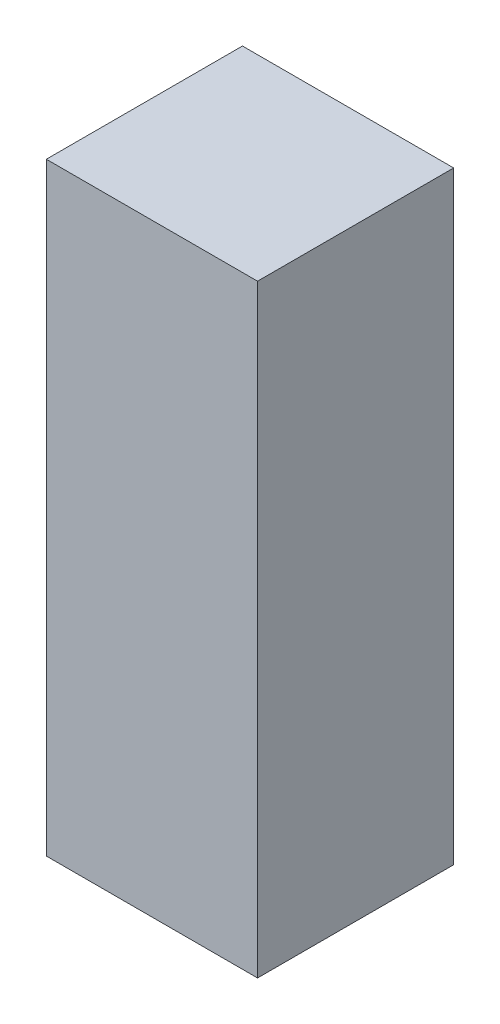
ISO-10303-21;
HEADER;
FILE_DESCRIPTION(('STEP AP214'),'2;1');
FILE_NAME('part.step','',(''),(''),'','','');
FILE_SCHEMA(('AUTOMOTIVE_DESIGN { 1 0 10303 214 1 1 1 1 }'));
ENDSEC;
DATA;
#1=APPLICATION_CONTEXT('core data for automotive mechanical design processes');
#2=APPLICATION_PROTOCOL_DEFINITION('international standard','automotive_design',2000,#1);
#3=PRODUCT_CONTEXT('',#1,'mechanical');
#4=PRODUCT('Part','Part','',(#3));
#5=PRODUCT_RELATED_PRODUCT_CATEGORY('part','',(#4));
#6=PRODUCT_DEFINITION_FORMATION('','',#4);
#7=PRODUCT_DEFINITION_CONTEXT('part definition',#1,'design');
#8=PRODUCT_DEFINITION('design','',#6,#7);
#9=PRODUCT_DEFINITION_SHAPE('','',#8);
#10=(LENGTH_UNIT() NAMED_UNIT(*) SI_UNIT(.MILLI.,.METRE.));
#11=(NAMED_UNIT(*) PLANE_ANGLE_UNIT() SI_UNIT($,.RADIAN.));
#12=(NAMED_UNIT(*) SI_UNIT($,.STERADIAN.) SOLID_ANGLE_UNIT());
#13=UNCERTAINTY_MEASURE_WITH_UNIT(LENGTH_MEASURE(1.E-05),#10,'distance_accuracy_value','');
#14=(GEOMETRIC_REPRESENTATION_CONTEXT(3) GLOBAL_UNCERTAINTY_ASSIGNED_CONTEXT((#13)) GLOBAL_UNIT_ASSIGNED_CONTEXT((#10,
#11,#12)) REPRESENTATION_CONTEXT('',''));
#15=CARTESIAN_POINT('',(0.,0.,0.));
#16=DIRECTION('',(0.,0.,1.));
#17=DIRECTION('',(1.,0.,0.));
#18=AXIS2_PLACEMENT_3D('',#15,#16,#17);
#19=CARTESIAN_POINT('',(24.,220.,33.));
#20=DIRECTION('',(1.,0.,0.));
#21=DIRECTION('',(0.,0.,-1.));
#22=AXIS2_PLACEMENT_3D('',#19,#20,#21);
#23=PLANE('',#22);
#24=DIRECTION('',(0.,-1.,0.));
#25=VECTOR('',#24,1.);
#26=CARTESIAN_POINT('',(24.,220.,20.));
#27=LINE('',#26,#25);
#28=CARTESIAN_POINT('',(24.,260.,20.));
#29=VERTEX_POINT('',#28);
#30=CARTESIAN_POINT('',(24.,220.,20.));
#31=VERTEX_POINT('',#30);
#32=EDGE_CURVE('E102',#29,#31,#27,.T.);
#33=ORIENTED_EDGE('',*,*,#32,.T.);
#34=DIRECTION('',(0.,0.,-1.));
#35=VECTOR('',#34,1.);
#36=CARTESIAN_POINT('',(24.,220.,33.));
#37=LINE('',#36,#35);
#38=CARTESIAN_POINT('',(24.,220.,33.));
#39=VERTEX_POINT('',#38);
#40=EDGE_CURVE('E11',#39,#31,#37,.T.);
#41=ORIENTED_EDGE('',*,*,#40,.F.);
#42=DIRECTION('',(0.,-1.,0.));
#43=VECTOR('',#42,1.);
#44=CARTESIAN_POINT('',(24.,220.,33.));
#45=LINE('',#44,#43);
#46=CARTESIAN_POINT('',(24.,260.,33.));
#47=VERTEX_POINT('',#46);
#48=EDGE_CURVE('E90',#47,#39,#45,.T.);
#49=ORIENTED_EDGE('',*,*,#48,.F.);
#50=DIRECTION('',(0.,0.,-1.));
#51=VECTOR('',#50,1.);
#52=CARTESIAN_POINT('',(24.,260.,33.));
#53=LINE('',#52,#51);
#54=EDGE_CURVE('E98',#47,#29,#53,.T.);
#55=ORIENTED_EDGE('',*,*,#54,.T.);
#56=EDGE_LOOP('',(#33,#41,#49,#55));
#57=FACE_BOUND('',#56,.T.);
#58=ADVANCED_FACE('F39',(#57),#23,.F.);
#59=CARTESIAN_POINT('',(24.,220.,33.));
#60=DIRECTION('',(0.,1.,0.));
#61=DIRECTION('',(0.,0.,1.));
#62=AXIS2_PLACEMENT_3D('',#59,#60,#61);
#63=PLANE('',#62);
#64=DIRECTION('',(1.,0.,0.));
#65=VECTOR('',#64,1.);
#66=CARTESIAN_POINT('',(24.,220.,20.));
#67=LINE('',#66,#65);
#68=CARTESIAN_POINT('',(38.,220.,20.));
#69=VERTEX_POINT('',#68);
#70=EDGE_CURVE('E94',#31,#69,#67,.T.);
#71=ORIENTED_EDGE('',*,*,#70,.T.);
#72=DIRECTION('',(0.,0.,-1.));
#73=VECTOR('',#72,1.);
#74=CARTESIAN_POINT('',(38.,220.,33.));
#75=LINE('',#74,#73);
#76=CARTESIAN_POINT('',(38.,220.,33.));
#77=VERTEX_POINT('',#76);
#78=EDGE_CURVE('E47',#77,#69,#75,.T.);
#79=ORIENTED_EDGE('',*,*,#78,.F.);
#80=DIRECTION('',(1.,0.,0.));
#81=VECTOR('',#80,1.);
#82=CARTESIAN_POINT('',(24.,220.,33.));
#83=LINE('',#82,#81);
#84=EDGE_CURVE('E85',#39,#77,#83,.T.);
#85=ORIENTED_EDGE('',*,*,#84,.F.);
#86=ORIENTED_EDGE('',*,*,#40,.T.);
#87=EDGE_LOOP('',(#71,#79,#85,#86));
#88=FACE_BOUND('',#87,.T.);
#89=ADVANCED_FACE('F93',(#88),#63,.F.);
#90=CARTESIAN_POINT('',(38.,220.,33.));
#91=DIRECTION('',(-1.,0.,0.));
#92=DIRECTION('',(0.,0.,1.));
#93=AXIS2_PLACEMENT_3D('',#90,#91,#92);
#94=PLANE('',#93);
#95=DIRECTION('',(0.,1.,0.));
#96=VECTOR('',#95,1.);
#97=CARTESIAN_POINT('',(38.,220.,20.));
#98=LINE('',#97,#96);
#99=CARTESIAN_POINT('',(38.,260.,20.));
#100=VERTEX_POINT('',#99);
#101=EDGE_CURVE('E72',#69,#100,#98,.T.);
#102=ORIENTED_EDGE('',*,*,#101,.T.);
#103=DIRECTION('',(0.,0.,-1.));
#104=VECTOR('',#103,1.);
#105=CARTESIAN_POINT('',(38.,260.,33.));
#106=LINE('',#105,#104);
#107=CARTESIAN_POINT('',(38.,260.,33.));
#108=VERTEX_POINT('',#107);
#109=EDGE_CURVE('E95',#108,#100,#106,.T.);
#110=ORIENTED_EDGE('',*,*,#109,.F.);
#111=DIRECTION('',(0.,1.,0.));
#112=VECTOR('',#111,1.);
#113=CARTESIAN_POINT('',(38.,220.,33.));
#114=LINE('',#113,#112);
#115=EDGE_CURVE('E88',#77,#108,#114,.T.);
#116=ORIENTED_EDGE('',*,*,#115,.F.);
#117=ORIENTED_EDGE('',*,*,#78,.T.);
#118=EDGE_LOOP('',(#102,#110,#116,#117));
#119=FACE_BOUND('',#118,.T.);
#120=ADVANCED_FACE('F96',(#119),#94,.F.);
#121=CARTESIAN_POINT('',(24.,260.,33.));
#122=DIRECTION('',(0.,-1.,0.));
#123=DIRECTION('',(0.,0.,-1.));
#124=AXIS2_PLACEMENT_3D('',#121,#122,#123);
#125=PLANE('',#124);
#126=DIRECTION('',(-1.,0.,0.));
#127=VECTOR('',#126,1.);
#128=CARTESIAN_POINT('',(24.,260.,20.));
#129=LINE('',#128,#127);
#130=EDGE_CURVE('E78',#100,#29,#129,.T.);
#131=ORIENTED_EDGE('',*,*,#130,.T.);
#132=ORIENTED_EDGE('',*,*,#54,.F.);
#133=DIRECTION('',(-1.,0.,0.));
#134=VECTOR('',#133,1.);
#135=CARTESIAN_POINT('',(24.,260.,33.));
#136=LINE('',#135,#134);
#137=EDGE_CURVE('E55',#108,#47,#136,.T.);
#138=ORIENTED_EDGE('',*,*,#137,.F.);
#139=ORIENTED_EDGE('',*,*,#109,.T.);
#140=EDGE_LOOP('',(#131,#132,#138,#139));
#141=FACE_BOUND('',#140,.T.);
#142=ADVANCED_FACE('F109',(#141),#125,.F.);
#143=CARTESIAN_POINT('',(0.,0.,33.));
#144=DIRECTION('',(0.,0.,-1.));
#145=DIRECTION('',(-1.,0.,0.));
#146=AXIS2_PLACEMENT_3D('',#143,#144,#145);
#147=PLANE('',#146);
#148=ORIENTED_EDGE('',*,*,#48,.T.);
#149=ORIENTED_EDGE('',*,*,#84,.T.);
#150=ORIENTED_EDGE('',*,*,#115,.T.);
#151=ORIENTED_EDGE('',*,*,#137,.T.);
#152=EDGE_LOOP('',(#148,#149,#150,#151));
#153=FACE_BOUND('',#152,.T.);
#154=ADVANCED_FACE('F86',(#153),#147,.F.);
#155=CARTESIAN_POINT('',(0.,0.,20.));
#156=DIRECTION('',(0.,0.,-1.));
#157=DIRECTION('',(-1.,0.,0.));
#158=AXIS2_PLACEMENT_3D('',#155,#156,#157);
#159=PLANE('',#158);
#160=ORIENTED_EDGE('',*,*,#32,.F.);
#161=ORIENTED_EDGE('',*,*,#130,.F.);
#162=ORIENTED_EDGE('',*,*,#101,.F.);
#163=ORIENTED_EDGE('',*,*,#70,.F.);
#164=EDGE_LOOP('',(#160,#161,#162,#163));
#165=FACE_BOUND('',#164,.T.);
#166=ADVANCED_FACE('F112',(#165),#159,.T.);
#167=CLOSED_SHELL('',(#58,#89,#120,#142,#154,#166));
#168=MANIFOLD_SOLID_BREP('B2',#167);
#169=ADVANCED_BREP_SHAPE_REPRESENTATION('',(#18,#168),#14);
#170=SHAPE_DEFINITION_REPRESENTATION(#9,#169);
ENDSEC;
END-ISO-10303-21;
